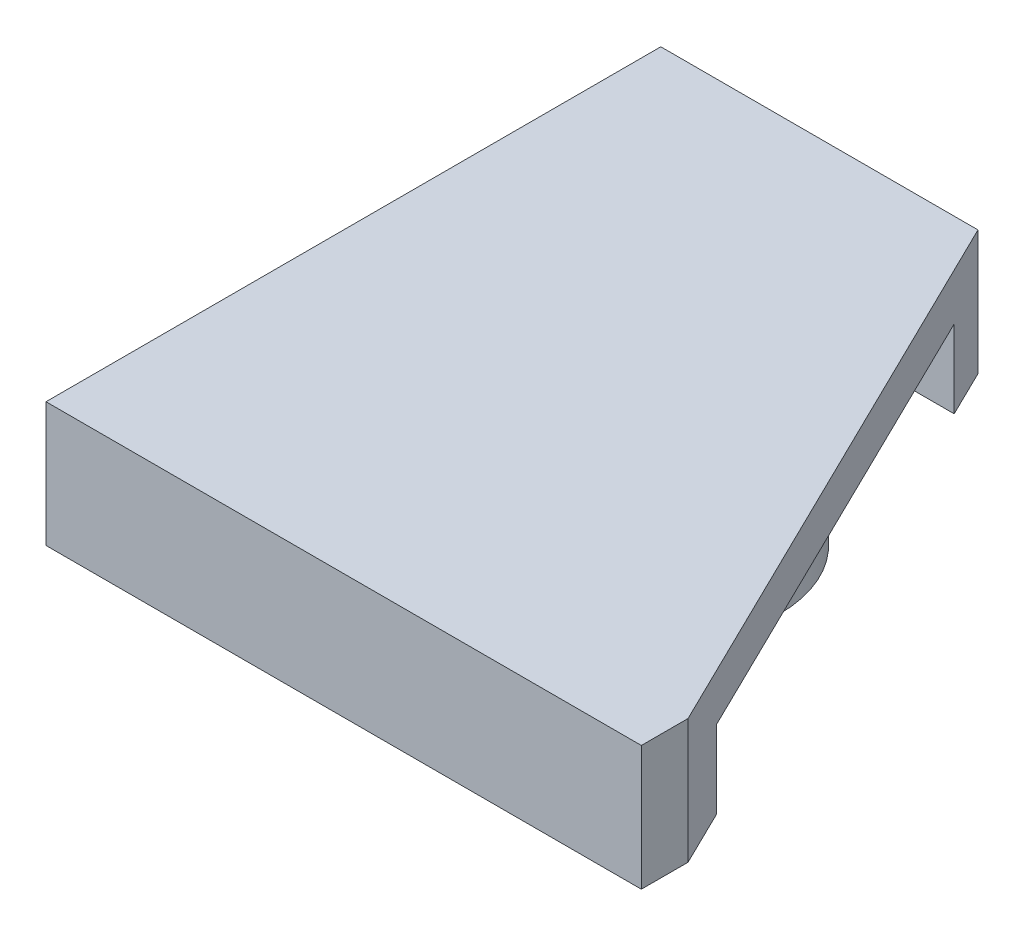
ISO-10303-21;
HEADER;
FILE_DESCRIPTION(('STEP AP214'),'2;1');
FILE_NAME('part.step','',(''),(''),'','','');
FILE_SCHEMA(('AUTOMOTIVE_DESIGN { 1 0 10303 214 1 1 1 1 }'));
ENDSEC;
DATA;
#1=APPLICATION_CONTEXT('core data for automotive mechanical design processes');
#2=APPLICATION_PROTOCOL_DEFINITION('international standard','automotive_design',2000,#1);
#3=PRODUCT_CONTEXT('',#1,'mechanical');
#4=PRODUCT('Part','Part','',(#3));
#5=PRODUCT_RELATED_PRODUCT_CATEGORY('part','',(#4));
#6=PRODUCT_DEFINITION_FORMATION('','',#4);
#7=PRODUCT_DEFINITION_CONTEXT('part definition',#1,'design');
#8=PRODUCT_DEFINITION('design','',#6,#7);
#9=PRODUCT_DEFINITION_SHAPE('','',#8);
#10=(LENGTH_UNIT() NAMED_UNIT(*) SI_UNIT(.MILLI.,.METRE.));
#11=(NAMED_UNIT(*) PLANE_ANGLE_UNIT() SI_UNIT($,.RADIAN.));
#12=(NAMED_UNIT(*) SI_UNIT($,.STERADIAN.) SOLID_ANGLE_UNIT());
#13=UNCERTAINTY_MEASURE_WITH_UNIT(LENGTH_MEASURE(1.E-05),#10,'distance_accuracy_value','');
#14=(GEOMETRIC_REPRESENTATION_CONTEXT(3) GLOBAL_UNCERTAINTY_ASSIGNED_CONTEXT((#13)) GLOBAL_UNIT_ASSIGNED_CONTEXT((#10,
#11,#12)) REPRESENTATION_CONTEXT('',''));
#15=CARTESIAN_POINT('',(0.,0.,0.));
#16=DIRECTION('',(0.,0.,1.));
#17=DIRECTION('',(1.,0.,0.));
#18=AXIS2_PLACEMENT_3D('',#15,#16,#17);
#19=CARTESIAN_POINT('',(0.681967213114738,0.,7.9));
#20=DIRECTION('',(0.,1.,0.));
#21=DIRECTION('',(0.,0.,1.));
#22=AXIS2_PLACEMENT_3D('',#19,#20,#21);
#23=PLANE('',#22);
#24=DIRECTION('',(1.,0.,0.));
#25=VECTOR('',#24,1.);
#26=CARTESIAN_POINT('',(0.681967213114738,0.,-7.9));
#27=LINE('',#26,#25);
#28=CARTESIAN_POINT('',(0.681967213114738,0.,-7.9));
#29=VERTEX_POINT('',#28);
#30=CARTESIAN_POINT('',(8.83366789338715,0.,-7.9));
#31=VERTEX_POINT('',#30);
#32=EDGE_CURVE('E219',#29,#31,#27,.T.);
#33=ORIENTED_EDGE('',*,*,#32,.T.);
#34=DIRECTION('',(-0.43973244135594,0.,-0.898128821505659));
#35=VECTOR('',#34,1.);
#36=CARTESIAN_POINT('',(8.83366789338715,0.,-7.9));
#37=LINE('',#36,#35);
#38=CARTESIAN_POINT('',(9.42119934432366,0.,-6.7));
#39=VERTEX_POINT('',#38);
#40=EDGE_CURVE('E160',#39,#31,#37,.T.);
#41=ORIENTED_EDGE('',*,*,#40,.F.);
#42=DIRECTION('',(1.,0.,0.));
#43=VECTOR('',#42,1.);
#44=CARTESIAN_POINT('',(0.,0.,-6.7));
#45=LINE('',#44,#43);
#46=CARTESIAN_POINT('',(1.88196721311474,0.,-6.7));
#47=VERTEX_POINT('',#46);
#48=EDGE_CURVE('E181',#47,#39,#45,.T.);
#49=ORIENTED_EDGE('',*,*,#48,.F.);
#50=DIRECTION('',(0.,0.,-1.));
#51=VECTOR('',#50,1.);
#52=CARTESIAN_POINT('',(1.88196721311474,0.,7.9));
#53=LINE('',#52,#51);
#54=CARTESIAN_POINT('',(1.88196721311474,0.,6.7));
#55=VERTEX_POINT('',#54);
#56=EDGE_CURVE('E198',#55,#47,#53,.T.);
#57=ORIENTED_EDGE('',*,*,#56,.F.);
#58=DIRECTION('',(1.,0.,0.));
#59=VECTOR('',#58,1.);
#60=CARTESIAN_POINT('',(0.,0.,6.7));
#61=LINE('',#60,#59);
#62=CARTESIAN_POINT('',(15.2819672131147,0.,6.7));
#63=VERTEX_POINT('',#62);
#64=EDGE_CURVE('E184',#55,#63,#61,.T.);
#65=ORIENTED_EDGE('',*,*,#64,.T.);
#66=DIRECTION('',(0.,0.,-1.));
#67=VECTOR('',#66,1.);
#68=CARTESIAN_POINT('',(15.2819672131147,0.,7.9));
#69=LINE('',#68,#67);
#70=CARTESIAN_POINT('',(15.2819672131147,0.,5.2702893033877));
#71=VERTEX_POINT('',#70);
#72=EDGE_CURVE('E196',#63,#71,#69,.T.);
#73=ORIENTED_EDGE('',*,*,#72,.T.);
#74=CARTESIAN_POINT('',(15.9819672131148,0.,6.69999999999997));
#75=VERTEX_POINT('',#74);
#76=EDGE_CURVE('E154',#75,#71,#37,.T.);
#77=ORIENTED_EDGE('',*,*,#76,.F.);
#78=DIRECTION('',(0.,0.,-1.));
#79=VECTOR('',#78,1.);
#80=CARTESIAN_POINT('',(15.9819672131148,0.,6.69999999999997));
#81=LINE('',#80,#79);
#82=CARTESIAN_POINT('',(15.9819672131147,0.,7.9));
#83=VERTEX_POINT('',#82);
#84=EDGE_CURVE('E148',#83,#75,#81,.T.);
#85=ORIENTED_EDGE('',*,*,#84,.F.);
#86=DIRECTION('',(1.,0.,0.));
#87=VECTOR('',#86,1.);
#88=CARTESIAN_POINT('',(0.681967213114738,0.,7.9));
#89=LINE('',#88,#87);
#90=CARTESIAN_POINT('',(0.681967213114738,0.,7.9));
#91=VERTEX_POINT('',#90);
#92=EDGE_CURVE('E210',#91,#83,#89,.T.);
#93=ORIENTED_EDGE('',*,*,#92,.F.);
#94=DIRECTION('',(0.,0.,-1.));
#95=VECTOR('',#94,1.);
#96=CARTESIAN_POINT('',(0.681967213114738,0.,7.9));
#97=LINE('',#96,#95);
#98=EDGE_CURVE('E225',#91,#29,#97,.T.);
#99=ORIENTED_EDGE('',*,*,#98,.T.);
#100=EDGE_LOOP('',(#33,#41,#49,#57,#65,#73,#77,#85,#93,#99));
#101=FACE_BOUND('',#100,.T.);
#102=ADVANCED_FACE('F45',(#101),#23,.F.);
#103=CARTESIAN_POINT('',(0.681967213114738,0.,7.9));
#104=DIRECTION('',(1.,0.,0.));
#105=DIRECTION('',(0.,0.,-1.));
#106=AXIS2_PLACEMENT_3D('',#103,#104,#105);
#107=PLANE('',#106);
#108=DIRECTION('',(0.,-1.,0.));
#109=VECTOR('',#108,1.);
#110=CARTESIAN_POINT('',(0.681967213114738,0.,-7.9));
#111=LINE('',#110,#109);
#112=CARTESIAN_POINT('',(0.681967213114738,3.2,-7.9));
#113=VERTEX_POINT('',#112);
#114=EDGE_CURVE('E200',#113,#29,#111,.T.);
#115=ORIENTED_EDGE('',*,*,#114,.T.);
#116=ORIENTED_EDGE('',*,*,#98,.F.);
#117=DIRECTION('',(0.,-1.,0.));
#118=VECTOR('',#117,1.);
#119=CARTESIAN_POINT('',(0.681967213114738,0.,7.9));
#120=LINE('',#119,#118);
#121=CARTESIAN_POINT('',(0.681967213114738,3.2,7.9));
#122=VERTEX_POINT('',#121);
#123=EDGE_CURVE('E207',#122,#91,#120,.T.);
#124=ORIENTED_EDGE('',*,*,#123,.F.);
#125=DIRECTION('',(0.,0.,-1.));
#126=VECTOR('',#125,1.);
#127=CARTESIAN_POINT('',(0.681967213114738,3.2,7.9));
#128=LINE('',#127,#126);
#129=EDGE_CURVE('E216',#122,#113,#128,.T.);
#130=ORIENTED_EDGE('',*,*,#129,.T.);
#131=EDGE_LOOP('',(#115,#116,#124,#130));
#132=FACE_BOUND('',#131,.T.);
#133=ADVANCED_FACE('F47',(#132),#107,.F.);
#134=CARTESIAN_POINT('',(0.681967213114738,3.2,7.9));
#135=DIRECTION('',(0.,-1.,0.));
#136=DIRECTION('',(1.,0.,0.));
#137=AXIS2_PLACEMENT_3D('',#134,#135,#136);
#138=PLANE('',#137);
#139=DIRECTION('',(-1.,0.,0.));
#140=VECTOR('',#139,1.);
#141=CARTESIAN_POINT('',(0.681967213114738,3.2,7.9));
#142=LINE('',#141,#140);
#143=CARTESIAN_POINT('',(15.9819672131147,3.2,7.9));
#144=VERTEX_POINT('',#143);
#145=EDGE_CURVE('E214',#144,#122,#142,.T.);
#146=ORIENTED_EDGE('',*,*,#145,.F.);
#147=DIRECTION('',(0.,0.,-1.));
#148=VECTOR('',#147,1.);
#149=CARTESIAN_POINT('',(15.9819672131148,3.2,6.69999999999997));
#150=LINE('',#149,#148);
#151=CARTESIAN_POINT('',(15.9819672131148,3.2,6.69999999999997));
#152=VERTEX_POINT('',#151);
#153=EDGE_CURVE('E150',#144,#152,#150,.T.);
#154=ORIENTED_EDGE('',*,*,#153,.T.);
#155=DIRECTION('',(-0.43973244135594,0.,-0.898128821505659));
#156=VECTOR('',#155,1.);
#157=CARTESIAN_POINT('',(8.83366789338715,3.2,-7.9));
#158=LINE('',#157,#156);
#159=CARTESIAN_POINT('',(8.83366789338715,3.2,-7.9));
#160=VERTEX_POINT('',#159);
#161=EDGE_CURVE('E153',#152,#160,#158,.T.);
#162=ORIENTED_EDGE('',*,*,#161,.T.);
#163=DIRECTION('',(-1.,0.,0.));
#164=VECTOR('',#163,1.);
#165=CARTESIAN_POINT('',(0.681967213114738,3.2,-7.9));
#166=LINE('',#165,#164);
#167=EDGE_CURVE('E211',#160,#113,#166,.T.);
#168=ORIENTED_EDGE('',*,*,#167,.T.);
#169=ORIENTED_EDGE('',*,*,#129,.F.);
#170=EDGE_LOOP('',(#146,#154,#162,#168,#169));
#171=FACE_BOUND('',#170,.T.);
#172=ADVANCED_FACE('F277',(#171),#138,.F.);
#173=CARTESIAN_POINT('',(0.,0.,7.9));
#174=DIRECTION('',(0.,0.,-1.));
#175=DIRECTION('',(-1.,0.,0.));
#176=AXIS2_PLACEMENT_3D('',#173,#174,#175);
#177=PLANE('',#176);
#178=ORIENTED_EDGE('',*,*,#92,.T.);
#179=DIRECTION('',(0.,-1.,0.));
#180=VECTOR('',#179,1.);
#181=CARTESIAN_POINT('',(15.9819672131147,3.2,7.9));
#182=LINE('',#181,#180);
#183=EDGE_CURVE('E162',#144,#83,#182,.T.);
#184=ORIENTED_EDGE('',*,*,#183,.F.);
#185=ORIENTED_EDGE('',*,*,#145,.T.);
#186=ORIENTED_EDGE('',*,*,#123,.T.);
#187=EDGE_LOOP('',(#178,#184,#185,#186));
#188=FACE_BOUND('',#187,.T.);
#189=ADVANCED_FACE('F282',(#188),#177,.F.);
#190=CARTESIAN_POINT('',(0.,0.,-7.9));
#191=DIRECTION('',(0.,0.,-1.));
#192=DIRECTION('',(-1.,0.,0.));
#193=AXIS2_PLACEMENT_3D('',#190,#191,#192);
#194=PLANE('',#193);
#195=DIRECTION('',(0.,-1.,0.));
#196=VECTOR('',#195,1.);
#197=CARTESIAN_POINT('',(8.83366789338715,3.2,-7.9));
#198=LINE('',#197,#196);
#199=EDGE_CURVE('E164',#160,#31,#198,.T.);
#200=ORIENTED_EDGE('',*,*,#199,.T.);
#201=ORIENTED_EDGE('',*,*,#32,.F.);
#202=ORIENTED_EDGE('',*,*,#114,.F.);
#203=ORIENTED_EDGE('',*,*,#167,.F.);
#204=EDGE_LOOP('',(#200,#201,#202,#203));
#205=FACE_BOUND('',#204,.T.);
#206=ADVANCED_FACE('F284',(#205),#194,.T.);
#207=CARTESIAN_POINT('',(1.88196721311474,0.,7.9));
#208=DIRECTION('',(1.,0.,0.));
#209=DIRECTION('',(0.,0.,-1.));
#210=AXIS2_PLACEMENT_3D('',#207,#208,#209);
#211=PLANE('',#210);
#212=DIRECTION('',(0.,-1.,0.));
#213=VECTOR('',#212,1.);
#214=CARTESIAN_POINT('',(1.88196721311474,0.,-6.7));
#215=LINE('',#214,#213);
#216=CARTESIAN_POINT('',(1.88196721311474,2.,-6.7));
#217=VERTEX_POINT('',#216);
#218=EDGE_CURVE('E178',#217,#47,#215,.T.);
#219=ORIENTED_EDGE('',*,*,#218,.F.);
#220=DIRECTION('',(0.,0.,-1.));
#221=VECTOR('',#220,1.);
#222=CARTESIAN_POINT('',(1.88196721311474,2.,7.9));
#223=LINE('',#222,#221);
#224=CARTESIAN_POINT('',(1.88196721311474,2.,6.7));
#225=VERTEX_POINT('',#224);
#226=EDGE_CURVE('E186',#225,#217,#223,.T.);
#227=ORIENTED_EDGE('',*,*,#226,.F.);
#228=DIRECTION('',(0.,-1.,0.));
#229=VECTOR('',#228,1.);
#230=CARTESIAN_POINT('',(1.88196721311474,0.,6.7));
#231=LINE('',#230,#229);
#232=EDGE_CURVE('E182',#225,#55,#231,.T.);
#233=ORIENTED_EDGE('',*,*,#232,.T.);
#234=ORIENTED_EDGE('',*,*,#56,.T.);
#235=EDGE_LOOP('',(#219,#227,#233,#234));
#236=FACE_BOUND('',#235,.T.);
#237=ADVANCED_FACE('F287',(#236),#211,.T.);
#238=CARTESIAN_POINT('',(15.2819672131147,0.,7.9));
#239=DIRECTION('',(-1.,0.,0.));
#240=DIRECTION('',(0.,0.,1.));
#241=AXIS2_PLACEMENT_3D('',#238,#239,#240);
#242=PLANE('',#241);
#243=DIRECTION('',(0.,1.,0.));
#244=VECTOR('',#243,1.);
#245=CARTESIAN_POINT('',(15.2819672131147,0.,5.27028930338769));
#246=LINE('',#245,#244);
#247=CARTESIAN_POINT('',(15.2819672131147,2.,5.27028930338769));
#248=VERTEX_POINT('',#247);
#249=EDGE_CURVE('E169',#71,#248,#246,.T.);
#250=ORIENTED_EDGE('',*,*,#249,.F.);
#251=ORIENTED_EDGE('',*,*,#72,.F.);
#252=DIRECTION('',(0.,1.,0.));
#253=VECTOR('',#252,1.);
#254=CARTESIAN_POINT('',(15.2819672131147,0.,6.7));
#255=LINE('',#254,#253);
#256=CARTESIAN_POINT('',(15.2819672131147,2.,6.7));
#257=VERTEX_POINT('',#256);
#258=EDGE_CURVE('E193',#63,#257,#255,.T.);
#259=ORIENTED_EDGE('',*,*,#258,.T.);
#260=DIRECTION('',(0.,0.,-1.));
#261=VECTOR('',#260,1.);
#262=CARTESIAN_POINT('',(15.2819672131147,2.,7.9));
#263=LINE('',#262,#261);
#264=EDGE_CURVE('E189',#257,#248,#263,.T.);
#265=ORIENTED_EDGE('',*,*,#264,.T.);
#266=EDGE_LOOP('',(#250,#251,#259,#265));
#267=FACE_BOUND('',#266,.T.);
#268=ADVANCED_FACE('F239',(#267),#242,.T.);
#269=CARTESIAN_POINT('',(0.681967213114738,2.,7.9));
#270=DIRECTION('',(0.,-1.,0.));
#271=DIRECTION('',(1.,0.,0.));
#272=AXIS2_PLACEMENT_3D('',#269,#270,#271);
#273=PLANE('',#272);
#274=CARTESIAN_POINT('',(13.7107424714246,2.,-3.74883214762885));
#275=DIRECTION('',(0.,-1.,0.));
#276=DIRECTION('',(1.,0.,0.));
#277=AXIS2_PLACEMENT_3D('',#274,#275,#276);
#278=CIRCLE('',#277,3.);
#279=CARTESIAN_POINT('',(11.8972711267549,2.,-1.35899498119637));
#280=VERTEX_POINT('',#279);
#281=CARTESIAN_POINT('',(10.7111535048734,2.,-3.69917299193567));
#282=VERTEX_POINT('',#281);
#283=EDGE_CURVE('E11',#280,#282,#278,.T.);
#284=ORIENTED_EDGE('',*,*,#283,.F.);
#285=DIRECTION('',(0.452094425934652,0.,0.8919700836008));
#286=VECTOR('',#285,1.);
#287=CARTESIAN_POINT('',(13.3387154961843,2.,1.48493580173187));
#288=LINE('',#287,#286);
#289=EDGE_CURVE('E53',#282,#280,#288,.T.);
#290=ORIENTED_EDGE('',*,*,#289,.F.);
#291=EDGE_LOOP('',(#284,#290));
#292=FACE_BOUND('',#291,.T.);
#293=DIRECTION('',(-0.43973244135594,0.,-0.89812882150566));
#294=VECTOR('',#293,1.);
#295=CARTESIAN_POINT('',(13.4974121826071,2.,1.62543585223084));
#296=LINE('',#295,#294);
#297=CARTESIAN_POINT('',(9.42119934432366,2.,-6.7));
#298=VERTEX_POINT('',#297);
#299=EDGE_CURVE('E67',#248,#298,#296,.T.);
#300=ORIENTED_EDGE('',*,*,#299,.F.);
#301=ORIENTED_EDGE('',*,*,#264,.F.);
#302=DIRECTION('',(-1.,0.,0.));
#303=VECTOR('',#302,1.);
#304=CARTESIAN_POINT('',(0.,2.,6.7));
#305=LINE('',#304,#303);
#306=EDGE_CURVE('E190',#257,#225,#305,.T.);
#307=ORIENTED_EDGE('',*,*,#306,.T.);
#308=ORIENTED_EDGE('',*,*,#226,.T.);
#309=DIRECTION('',(-1.,0.,0.));
#310=VECTOR('',#309,1.);
#311=CARTESIAN_POINT('',(0.,2.,-6.7));
#312=LINE('',#311,#310);
#313=EDGE_CURVE('E185',#298,#217,#312,.T.);
#314=ORIENTED_EDGE('',*,*,#313,.F.);
#315=EDGE_LOOP('',(#300,#301,#307,#308,#314));
#316=FACE_BOUND('',#315,.T.);
#317=CARTESIAN_POINT('',(8.58196721311474,2.,0.));
#318=DIRECTION('',(0.,-1.,0.));
#319=DIRECTION('',(1.,0.,0.));
#320=AXIS2_PLACEMENT_3D('',#317,#318,#319);
#321=CIRCLE('',#320,3.05);
#322=CARTESIAN_POINT('',(11.6319672131147,2.,0.));
#323=VERTEX_POINT('',#322);
#324=EDGE_CURVE('E177',#323,#323,#321,.F.);
#325=ORIENTED_EDGE('',*,*,#324,.T.);
#326=EDGE_LOOP('',(#325));
#327=FACE_BOUND('',#326,.T.);
#328=ADVANCED_FACE('F235',(#292,#316,#327),#273,.T.);
#329=CARTESIAN_POINT('',(0.,0.,6.7));
#330=DIRECTION('',(0.,0.,-1.));
#331=DIRECTION('',(-1.,0.,0.));
#332=AXIS2_PLACEMENT_3D('',#329,#330,#331);
#333=PLANE('',#332);
#334=ORIENTED_EDGE('',*,*,#232,.F.);
#335=ORIENTED_EDGE('',*,*,#306,.F.);
#336=ORIENTED_EDGE('',*,*,#258,.F.);
#337=ORIENTED_EDGE('',*,*,#64,.F.);
#338=EDGE_LOOP('',(#334,#335,#336,#337));
#339=FACE_BOUND('',#338,.T.);
#340=ADVANCED_FACE('F238',(#339),#333,.T.);
#341=CARTESIAN_POINT('',(0.,0.,-6.7));
#342=DIRECTION('',(0.,0.,-1.));
#343=DIRECTION('',(-1.,0.,0.));
#344=AXIS2_PLACEMENT_3D('',#341,#342,#343);
#345=PLANE('',#344);
#346=ORIENTED_EDGE('',*,*,#48,.T.);
#347=DIRECTION('',(0.,1.,0.));
#348=VECTOR('',#347,1.);
#349=CARTESIAN_POINT('',(9.42119934432366,0.,-6.7));
#350=LINE('',#349,#348);
#351=EDGE_CURVE('E231',#39,#298,#350,.T.);
#352=ORIENTED_EDGE('',*,*,#351,.T.);
#353=ORIENTED_EDGE('',*,*,#313,.T.);
#354=ORIENTED_EDGE('',*,*,#218,.T.);
#355=EDGE_LOOP('',(#346,#352,#353,#354));
#356=FACE_BOUND('',#355,.T.);
#357=ADVANCED_FACE('F257',(#356),#345,.F.);
#358=CARTESIAN_POINT('',(8.58196721311474,0.,0.));
#359=DIRECTION('',(0.,-1.,0.));
#360=DIRECTION('',(0.,0.,-1.));
#361=AXIS2_PLACEMENT_3D('',#358,#359,#360);
#362=PLANE('',#361);
#363=CARTESIAN_POINT('',(8.58196721311474,0.,0.));
#364=DIRECTION('',(0.,-1.,0.));
#365=DIRECTION('',(0.,0.,-1.));
#366=AXIS2_PLACEMENT_3D('',#363,#364,#365);
#367=CIRCLE('',#366,3.05);
#368=CARTESIAN_POINT('',(8.58196721311474,0.,-3.05));
#369=VERTEX_POINT('',#368);
#370=EDGE_CURVE('E174',#369,#369,#367,.T.);
#371=ORIENTED_EDGE('',*,*,#370,.T.);
#372=EDGE_LOOP('',(#371));
#373=FACE_BOUND('',#372,.T.);
#374=CARTESIAN_POINT('',(8.58196721311474,0.,0.));
#375=DIRECTION('',(0.,-1.,0.));
#376=DIRECTION('',(0.,0.,-1.));
#377=AXIS2_PLACEMENT_3D('',#374,#375,#376);
#378=CIRCLE('',#377,2.4);
#379=CARTESIAN_POINT('',(8.58196721311474,0.,-2.4));
#380=VERTEX_POINT('',#379);
#381=EDGE_CURVE('E171',#380,#380,#378,.T.);
#382=ORIENTED_EDGE('',*,*,#381,.F.);
#383=EDGE_LOOP('',(#382));
#384=FACE_BOUND('',#383,.T.);
#385=ADVANCED_FACE('F251',(#373,#384),#362,.T.);
#386=CARTESIAN_POINT('',(8.58196721311474,0.,0.));
#387=DIRECTION('',(0.,1.,0.));
#388=DIRECTION('',(0.,0.,1.));
#389=AXIS2_PLACEMENT_3D('',#386,#387,#388);
#390=CYLINDRICAL_SURFACE('',#389,3.05);
#391=ORIENTED_EDGE('',*,*,#324,.F.);
#392=EDGE_LOOP('',(#391));
#393=FACE_BOUND('',#392,.T.);
#394=ORIENTED_EDGE('',*,*,#370,.F.);
#395=EDGE_LOOP('',(#394));
#396=FACE_BOUND('',#395,.T.);
#397=ADVANCED_FACE('F247',(#393,#396),#390,.T.);
#398=CARTESIAN_POINT('',(8.58196721311474,0.,0.));
#399=DIRECTION('',(0.,1.,0.));
#400=DIRECTION('',(0.,0.,1.));
#401=AXIS2_PLACEMENT_3D('',#398,#399,#400);
#402=CYLINDRICAL_SURFACE('',#401,2.4);
#403=CARTESIAN_POINT('',(8.58196721311474,2.,0.));
#404=DIRECTION('',(0.,-1.,0.));
#405=DIRECTION('',(1.,0.,0.));
#406=AXIS2_PLACEMENT_3D('',#403,#404,#405);
#407=CIRCLE('',#406,2.4);
#408=CARTESIAN_POINT('',(10.9819672131147,2.,0.));
#409=VERTEX_POINT('',#408);
#410=EDGE_CURVE('E228',#409,#409,#407,.F.);
#411=ORIENTED_EDGE('',*,*,#410,.T.);
#412=EDGE_LOOP('',(#411));
#413=FACE_BOUND('',#412,.T.);
#414=ORIENTED_EDGE('',*,*,#381,.T.);
#415=EDGE_LOOP('',(#414));
#416=FACE_BOUND('',#415,.T.);
#417=ADVANCED_FACE('F250',(#413,#416),#402,.F.);
#418=ORIENTED_EDGE('',*,*,#410,.F.);
#419=EDGE_LOOP('',(#418));
#420=FACE_BOUND('',#419,.T.);
#421=ADVANCED_FACE('F241',(#420),#273,.T.);
#422=CARTESIAN_POINT('',(15.9819672131148,3.2,6.69999999999997));
#423=DIRECTION('',(-1.,0.,0.));
#424=DIRECTION('',(0.,0.,1.));
#425=AXIS2_PLACEMENT_3D('',#422,#423,#424);
#426=PLANE('',#425);
#427=ORIENTED_EDGE('',*,*,#84,.T.);
#428=DIRECTION('',(0.,-1.,0.));
#429=VECTOR('',#428,1.);
#430=CARTESIAN_POINT('',(15.9819672131148,3.2,6.69999999999997));
#431=LINE('',#430,#429);
#432=EDGE_CURVE('E157',#152,#75,#431,.T.);
#433=ORIENTED_EDGE('',*,*,#432,.F.);
#434=ORIENTED_EDGE('',*,*,#153,.F.);
#435=ORIENTED_EDGE('',*,*,#183,.T.);
#436=EDGE_LOOP('',(#427,#433,#434,#435));
#437=FACE_BOUND('',#436,.T.);
#438=ADVANCED_FACE('F268',(#437),#426,.F.);
#439=CARTESIAN_POINT('',(8.83366789338715,3.2,-7.9));
#440=DIRECTION('',(-0.898128821505659,0.,0.43973244135594));
#441=DIRECTION('',(0.43973244135594,0.,0.89812882150566));
#442=AXIS2_PLACEMENT_3D('',#439,#440,#441);
#443=PLANE('',#442);
#444=ORIENTED_EDGE('',*,*,#249,.T.);
#445=ORIENTED_EDGE('',*,*,#299,.T.);
#446=ORIENTED_EDGE('',*,*,#351,.F.);
#447=ORIENTED_EDGE('',*,*,#40,.T.);
#448=ORIENTED_EDGE('',*,*,#199,.F.);
#449=ORIENTED_EDGE('',*,*,#161,.F.);
#450=ORIENTED_EDGE('',*,*,#432,.T.);
#451=ORIENTED_EDGE('',*,*,#76,.T.);
#452=EDGE_LOOP('',(#444,#445,#446,#447,#448,#449,#450,#451));
#453=FACE_BOUND('',#452,.T.);
#454=ADVANCED_FACE('F312',(#453),#443,.F.);
#455=CARTESIAN_POINT('',(13.7107424714246,2.2,-3.74883214762885));
#456=DIRECTION('',(0.,-1.,0.));
#457=DIRECTION('',(0.,0.,-1.));
#458=AXIS2_PLACEMENT_3D('',#455,#456,#457);
#459=CYLINDRICAL_SURFACE('',#458,3.);
#460=ORIENTED_EDGE('',*,*,#283,.T.);
#461=DIRECTION('',(0.,-1.,0.));
#462=VECTOR('',#461,1.);
#463=CARTESIAN_POINT('',(10.7111535048734,2.2,-3.69917299193567));
#464=LINE('',#463,#462);
#465=CARTESIAN_POINT('',(10.7111535048734,2.2,-3.69917299193567));
#466=VERTEX_POINT('',#465);
#467=EDGE_CURVE('E60',#466,#282,#464,.T.);
#468=ORIENTED_EDGE('',*,*,#467,.F.);
#469=CARTESIAN_POINT('',(13.7107424714246,2.2,-3.74883214762885));
#470=DIRECTION('',(0.,-1.,0.));
#471=DIRECTION('',(0.,0.,-1.));
#472=AXIS2_PLACEMENT_3D('',#469,#470,#471);
#473=CIRCLE('',#472,3.);
#474=CARTESIAN_POINT('',(11.8972711267549,2.2,-1.35899498119637));
#475=VERTEX_POINT('',#474);
#476=EDGE_CURVE('E135',#475,#466,#473,.T.);
#477=ORIENTED_EDGE('',*,*,#476,.F.);
#478=DIRECTION('',(0.,-1.,0.));
#479=VECTOR('',#478,1.);
#480=CARTESIAN_POINT('',(11.8972711267549,2.2,-1.35899498119637));
#481=LINE('',#480,#479);
#482=EDGE_CURVE('E139',#475,#280,#481,.T.);
#483=ORIENTED_EDGE('',*,*,#482,.T.);
#484=EDGE_LOOP('',(#460,#468,#477,#483));
#485=FACE_BOUND('',#484,.T.);
#486=ADVANCED_FACE('F133',(#485),#459,.F.);
#487=CARTESIAN_POINT('',(10.7111535048734,2.2,-3.69917299193567));
#488=DIRECTION('',(0.8919700836008,0.,-0.452094425934652));
#489=DIRECTION('',(-0.452094425934652,0.,-0.8919700836008));
#490=AXIS2_PLACEMENT_3D('',#487,#488,#489);
#491=PLANE('',#490);
#492=ORIENTED_EDGE('',*,*,#289,.T.);
#493=ORIENTED_EDGE('',*,*,#482,.F.);
#494=DIRECTION('',(0.452094425934652,0.,0.8919700836008));
#495=VECTOR('',#494,1.);
#496=CARTESIAN_POINT('',(10.7111535048734,2.2,-3.69917299193567));
#497=LINE('',#496,#495);
#498=EDGE_CURVE('E140',#466,#475,#497,.T.);
#499=ORIENTED_EDGE('',*,*,#498,.F.);
#500=ORIENTED_EDGE('',*,*,#467,.T.);
#501=EDGE_LOOP('',(#492,#493,#499,#500));
#502=FACE_BOUND('',#501,.T.);
#503=ADVANCED_FACE('F145',(#502),#491,.F.);
#504=CARTESIAN_POINT('',(13.7107424714246,2.2,-3.74883214762885));
#505=DIRECTION('',(0.,-1.,0.));
#506=DIRECTION('',(0.,0.,-1.));
#507=AXIS2_PLACEMENT_3D('',#504,#505,#506);
#508=PLANE('',#507);
#509=ORIENTED_EDGE('',*,*,#476,.T.);
#510=ORIENTED_EDGE('',*,*,#498,.T.);
#511=EDGE_LOOP('',(#509,#510));
#512=FACE_BOUND('',#511,.T.);
#513=ADVANCED_FACE('F143',(#512),#508,.T.);
#514=CLOSED_SHELL('',(#102,#133,#172,#189,#206,#237,#268,#328,#340,#357,#385,#397,#417,#421,
#438,#454,#486,#503,#513));
#515=MANIFOLD_SOLID_BREP('B2',#514);
#516=ADVANCED_BREP_SHAPE_REPRESENTATION('',(#18,#515),#14);
#517=SHAPE_DEFINITION_REPRESENTATION(#9,#516);
ENDSEC;
END-ISO-10303-21;
